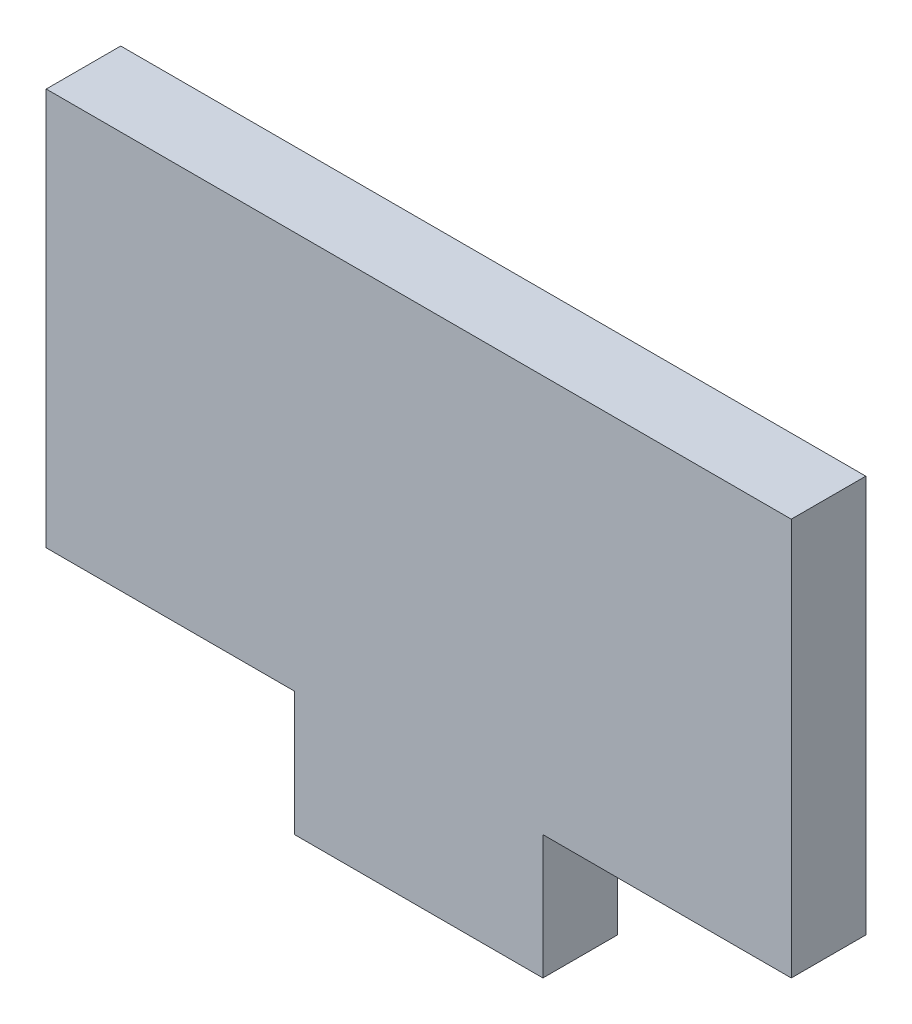
ISO-10303-21;
HEADER;
FILE_DESCRIPTION(('STEP AP214'),'2;1');
FILE_NAME('part.step','',(''),(''),'','','');
FILE_SCHEMA(('AUTOMOTIVE_DESIGN { 1 0 10303 214 1 1 1 1 }'));
ENDSEC;
DATA;
#1=APPLICATION_CONTEXT('core data for automotive mechanical design processes');
#2=APPLICATION_PROTOCOL_DEFINITION('international standard','automotive_design',2000,#1);
#3=PRODUCT_CONTEXT('',#1,'mechanical');
#4=PRODUCT('Part','Part','',(#3));
#5=PRODUCT_RELATED_PRODUCT_CATEGORY('part','',(#4));
#6=PRODUCT_DEFINITION_FORMATION('','',#4);
#7=PRODUCT_DEFINITION_CONTEXT('part definition',#1,'design');
#8=PRODUCT_DEFINITION('design','',#6,#7);
#9=PRODUCT_DEFINITION_SHAPE('','',#8);
#10=(LENGTH_UNIT() NAMED_UNIT(*) SI_UNIT(.MILLI.,.METRE.));
#11=(NAMED_UNIT(*) PLANE_ANGLE_UNIT() SI_UNIT($,.RADIAN.));
#12=(NAMED_UNIT(*) SI_UNIT($,.STERADIAN.) SOLID_ANGLE_UNIT());
#13=UNCERTAINTY_MEASURE_WITH_UNIT(LENGTH_MEASURE(1.E-05),#10,'distance_accuracy_value','');
#14=(GEOMETRIC_REPRESENTATION_CONTEXT(3) GLOBAL_UNCERTAINTY_ASSIGNED_CONTEXT((#13)) GLOBAL_UNIT_ASSIGNED_CONTEXT((#10,
#11,#12)) REPRESENTATION_CONTEXT('',''));
#15=CARTESIAN_POINT('',(0.,0.,0.));
#16=DIRECTION('',(0.,0.,1.));
#17=DIRECTION('',(1.,0.,0.));
#18=AXIS2_PLACEMENT_3D('',#15,#16,#17);
#19=CARTESIAN_POINT('',(15.,10.5,3.));
#20=DIRECTION('',(-1.,0.,0.));
#21=DIRECTION('',(0.,-1.,0.));
#22=AXIS2_PLACEMENT_3D('',#19,#20,#21);
#23=PLANE('',#22);
#24=DIRECTION('',(0.,1.,0.));
#25=VECTOR('',#24,1.);
#26=CARTESIAN_POINT('',(15.,10.5,3.));
#27=LINE('',#26,#25);
#28=CARTESIAN_POINT('',(15.,-5.5,3.));
#29=VERTEX_POINT('',#28);
#30=CARTESIAN_POINT('',(15.,10.5,3.));
#31=VERTEX_POINT('',#30);
#32=EDGE_CURVE('E121',#29,#31,#27,.T.);
#33=ORIENTED_EDGE('',*,*,#32,.F.);
#34=DIRECTION('',(0.,0.,1.));
#35=VECTOR('',#34,1.);
#36=CARTESIAN_POINT('',(15.,-5.5,0.));
#37=LINE('',#36,#35);
#38=CARTESIAN_POINT('',(15.,-5.5,0.));
#39=VERTEX_POINT('',#38);
#40=EDGE_CURVE('E159',#39,#29,#37,.T.);
#41=ORIENTED_EDGE('',*,*,#40,.F.);
#42=DIRECTION('',(0.,1.,0.));
#43=VECTOR('',#42,1.);
#44=CARTESIAN_POINT('',(15.,10.5,0.));
#45=LINE('',#44,#43);
#46=CARTESIAN_POINT('',(15.,10.5,0.));
#47=VERTEX_POINT('',#46);
#48=EDGE_CURVE('E143',#39,#47,#45,.T.);
#49=ORIENTED_EDGE('',*,*,#48,.T.);
#50=DIRECTION('',(0.,0.,-1.));
#51=VECTOR('',#50,1.);
#52=CARTESIAN_POINT('',(15.,10.5,3.));
#53=LINE('',#52,#51);
#54=EDGE_CURVE('E11',#31,#47,#53,.T.);
#55=ORIENTED_EDGE('',*,*,#54,.F.);
#56=EDGE_LOOP('',(#33,#41,#49,#55));
#57=FACE_BOUND('',#56,.T.);
#58=ADVANCED_FACE('F36',(#57),#23,.F.);
#59=CARTESIAN_POINT('',(-15.,10.5,3.));
#60=DIRECTION('',(0.,-1.,0.));
#61=DIRECTION('',(0.,0.,-1.));
#62=AXIS2_PLACEMENT_3D('',#59,#60,#61);
#63=PLANE('',#62);
#64=DIRECTION('',(-1.,0.,0.));
#65=VECTOR('',#64,1.);
#66=CARTESIAN_POINT('',(-15.,10.5,0.));
#67=LINE('',#66,#65);
#68=CARTESIAN_POINT('',(-15.,10.5,0.));
#69=VERTEX_POINT('',#68);
#70=EDGE_CURVE('E127',#47,#69,#67,.T.);
#71=ORIENTED_EDGE('',*,*,#70,.T.);
#72=DIRECTION('',(0.,0.,-1.));
#73=VECTOR('',#72,1.);
#74=CARTESIAN_POINT('',(-15.,10.5,3.));
#75=LINE('',#74,#73);
#76=CARTESIAN_POINT('',(-15.,10.5,3.));
#77=VERTEX_POINT('',#76);
#78=EDGE_CURVE('E43',#77,#69,#75,.T.);
#79=ORIENTED_EDGE('',*,*,#78,.F.);
#80=DIRECTION('',(-1.,0.,0.));
#81=VECTOR('',#80,1.);
#82=CARTESIAN_POINT('',(-15.,10.5,3.));
#83=LINE('',#82,#81);
#84=EDGE_CURVE('E124',#31,#77,#83,.T.);
#85=ORIENTED_EDGE('',*,*,#84,.F.);
#86=ORIENTED_EDGE('',*,*,#54,.T.);
#87=EDGE_LOOP('',(#71,#79,#85,#86));
#88=FACE_BOUND('',#87,.T.);
#89=ADVANCED_FACE('F147',(#88),#63,.F.);
#90=CARTESIAN_POINT('',(-15.,10.5,3.));
#91=DIRECTION('',(1.,0.,0.));
#92=DIRECTION('',(0.,1.,0.));
#93=AXIS2_PLACEMENT_3D('',#90,#91,#92);
#94=PLANE('',#93);
#95=DIRECTION('',(0.,-1.,0.));
#96=VECTOR('',#95,1.);
#97=CARTESIAN_POINT('',(-15.,10.5,0.));
#98=LINE('',#97,#96);
#99=CARTESIAN_POINT('',(-15.,-5.5,0.));
#100=VERTEX_POINT('',#99);
#101=EDGE_CURVE('E122',#69,#100,#98,.T.);
#102=ORIENTED_EDGE('',*,*,#101,.T.);
#103=DIRECTION('',(0.,0.,1.));
#104=VECTOR('',#103,1.);
#105=CARTESIAN_POINT('',(-15.,-5.5,0.));
#106=LINE('',#105,#104);
#107=CARTESIAN_POINT('',(-15.,-5.5,3.));
#108=VERTEX_POINT('',#107);
#109=EDGE_CURVE('E144',#100,#108,#106,.T.);
#110=ORIENTED_EDGE('',*,*,#109,.T.);
#111=DIRECTION('',(0.,-1.,0.));
#112=VECTOR('',#111,1.);
#113=CARTESIAN_POINT('',(-15.,10.5,3.));
#114=LINE('',#113,#112);
#115=EDGE_CURVE('E135',#77,#108,#114,.T.);
#116=ORIENTED_EDGE('',*,*,#115,.F.);
#117=ORIENTED_EDGE('',*,*,#78,.T.);
#118=EDGE_LOOP('',(#102,#110,#116,#117));
#119=FACE_BOUND('',#118,.T.);
#120=ADVANCED_FACE('F152',(#119),#94,.F.);
#121=CARTESIAN_POINT('',(-15.,-10.5,3.));
#122=DIRECTION('',(0.,1.,0.));
#123=DIRECTION('',(0.,0.,1.));
#124=AXIS2_PLACEMENT_3D('',#121,#122,#123);
#125=PLANE('',#124);
#126=DIRECTION('',(1.,0.,0.));
#127=VECTOR('',#126,1.);
#128=CARTESIAN_POINT('',(-15.,-10.5,3.));
#129=LINE('',#128,#127);
#130=CARTESIAN_POINT('',(-5.,-10.5,3.));
#131=VERTEX_POINT('',#130);
#132=CARTESIAN_POINT('',(5.,-10.5,3.));
#133=VERTEX_POINT('',#132);
#134=EDGE_CURVE('E117',#131,#133,#129,.T.);
#135=ORIENTED_EDGE('',*,*,#134,.F.);
#136=DIRECTION('',(0.,0.,1.));
#137=VECTOR('',#136,1.);
#138=CARTESIAN_POINT('',(-5.,-10.5,0.));
#139=LINE('',#138,#137);
#140=CARTESIAN_POINT('',(-5.,-10.5,0.));
#141=VERTEX_POINT('',#140);
#142=EDGE_CURVE('E103',#141,#131,#139,.T.);
#143=ORIENTED_EDGE('',*,*,#142,.F.);
#144=DIRECTION('',(1.,0.,0.));
#145=VECTOR('',#144,1.);
#146=CARTESIAN_POINT('',(-15.,-10.5,0.));
#147=LINE('',#146,#145);
#148=CARTESIAN_POINT('',(5.,-10.5,0.));
#149=VERTEX_POINT('',#148);
#150=EDGE_CURVE('E115',#141,#149,#147,.T.);
#151=ORIENTED_EDGE('',*,*,#150,.T.);
#152=DIRECTION('',(0.,0.,1.));
#153=VECTOR('',#152,1.);
#154=CARTESIAN_POINT('',(5.,-10.5,0.));
#155=LINE('',#154,#153);
#156=EDGE_CURVE('E163',#149,#133,#155,.T.);
#157=ORIENTED_EDGE('',*,*,#156,.T.);
#158=EDGE_LOOP('',(#135,#143,#151,#157));
#159=FACE_BOUND('',#158,.T.);
#160=ADVANCED_FACE('F113',(#159),#125,.F.);
#161=CARTESIAN_POINT('',(0.,0.,3.));
#162=DIRECTION('',(0.,0.,1.));
#163=DIRECTION('',(1.,0.,0.));
#164=AXIS2_PLACEMENT_3D('',#161,#162,#163);
#165=PLANE('',#164);
#166=DIRECTION('',(-1.,0.,0.));
#167=VECTOR('',#166,1.);
#168=CARTESIAN_POINT('',(-15.,-5.5,3.));
#169=LINE('',#168,#167);
#170=CARTESIAN_POINT('',(-5.,-5.5,3.));
#171=VERTEX_POINT('',#170);
#172=EDGE_CURVE('E108',#171,#108,#169,.T.);
#173=ORIENTED_EDGE('',*,*,#172,.F.);
#174=DIRECTION('',(0.,1.,0.));
#175=VECTOR('',#174,1.);
#176=CARTESIAN_POINT('',(-5.,-10.5,3.));
#177=LINE('',#176,#175);
#178=EDGE_CURVE('E165',#131,#171,#177,.T.);
#179=ORIENTED_EDGE('',*,*,#178,.F.);
#180=ORIENTED_EDGE('',*,*,#134,.T.);
#181=DIRECTION('',(0.,-1.,0.));
#182=VECTOR('',#181,1.);
#183=CARTESIAN_POINT('',(5.,-10.5,3.));
#184=LINE('',#183,#182);
#185=CARTESIAN_POINT('',(5.,-5.5,3.));
#186=VERTEX_POINT('',#185);
#187=EDGE_CURVE('E166',#186,#133,#184,.T.);
#188=ORIENTED_EDGE('',*,*,#187,.F.);
#189=DIRECTION('',(-1.,0.,0.));
#190=VECTOR('',#189,1.);
#191=CARTESIAN_POINT('',(15.,-5.5,3.));
#192=LINE('',#191,#190);
#193=EDGE_CURVE('E169',#29,#186,#192,.T.);
#194=ORIENTED_EDGE('',*,*,#193,.F.);
#195=ORIENTED_EDGE('',*,*,#32,.T.);
#196=ORIENTED_EDGE('',*,*,#84,.T.);
#197=ORIENTED_EDGE('',*,*,#115,.T.);
#198=EDGE_LOOP('',(#173,#179,#180,#188,#194,#195,#196,#197));
#199=FACE_BOUND('',#198,.T.);
#200=ADVANCED_FACE('F155',(#199),#165,.T.);
#201=CARTESIAN_POINT('',(0.,0.,0.));
#202=DIRECTION('',(0.,0.,1.));
#203=DIRECTION('',(1.,0.,0.));
#204=AXIS2_PLACEMENT_3D('',#201,#202,#203);
#205=PLANE('',#204);
#206=DIRECTION('',(0.,1.,0.));
#207=VECTOR('',#206,1.);
#208=CARTESIAN_POINT('',(-5.,-10.5,0.));
#209=LINE('',#208,#207);
#210=CARTESIAN_POINT('',(-5.,-5.5,0.));
#211=VERTEX_POINT('',#210);
#212=EDGE_CURVE('E99',#141,#211,#209,.T.);
#213=ORIENTED_EDGE('',*,*,#212,.T.);
#214=DIRECTION('',(-1.,0.,0.));
#215=VECTOR('',#214,1.);
#216=CARTESIAN_POINT('',(-15.,-5.5,0.));
#217=LINE('',#216,#215);
#218=EDGE_CURVE('E50',#211,#100,#217,.T.);
#219=ORIENTED_EDGE('',*,*,#218,.T.);
#220=ORIENTED_EDGE('',*,*,#101,.F.);
#221=ORIENTED_EDGE('',*,*,#70,.F.);
#222=ORIENTED_EDGE('',*,*,#48,.F.);
#223=DIRECTION('',(-1.,0.,0.));
#224=VECTOR('',#223,1.);
#225=CARTESIAN_POINT('',(15.,-5.5,0.));
#226=LINE('',#225,#224);
#227=CARTESIAN_POINT('',(5.,-5.5,0.));
#228=VERTEX_POINT('',#227);
#229=EDGE_CURVE('E168',#39,#228,#226,.T.);
#230=ORIENTED_EDGE('',*,*,#229,.T.);
#231=DIRECTION('',(0.,-1.,0.));
#232=VECTOR('',#231,1.);
#233=CARTESIAN_POINT('',(5.,-10.5,0.));
#234=LINE('',#233,#232);
#235=EDGE_CURVE('E58',#228,#149,#234,.T.);
#236=ORIENTED_EDGE('',*,*,#235,.T.);
#237=ORIENTED_EDGE('',*,*,#150,.F.);
#238=EDGE_LOOP('',(#213,#219,#220,#221,#222,#230,#236,#237));
#239=FACE_BOUND('',#238,.T.);
#240=ADVANCED_FACE('F119',(#239),#205,.F.);
#241=CARTESIAN_POINT('',(5.,-10.5,0.));
#242=DIRECTION('',(-1.,0.,0.));
#243=DIRECTION('',(0.,0.,1.));
#244=AXIS2_PLACEMENT_3D('',#241,#242,#243);
#245=PLANE('',#244);
#246=ORIENTED_EDGE('',*,*,#187,.T.);
#247=ORIENTED_EDGE('',*,*,#156,.F.);
#248=ORIENTED_EDGE('',*,*,#235,.F.);
#249=DIRECTION('',(0.,0.,1.));
#250=VECTOR('',#249,1.);
#251=CARTESIAN_POINT('',(5.,-5.5,0.));
#252=LINE('',#251,#250);
#253=EDGE_CURVE('E161',#228,#186,#252,.T.);
#254=ORIENTED_EDGE('',*,*,#253,.T.);
#255=EDGE_LOOP('',(#246,#247,#248,#254));
#256=FACE_BOUND('',#255,.T.);
#257=ADVANCED_FACE('F186',(#256),#245,.F.);
#258=CARTESIAN_POINT('',(15.,-5.5,0.));
#259=DIRECTION('',(0.,1.,0.));
#260=DIRECTION('',(-1.,0.,0.));
#261=AXIS2_PLACEMENT_3D('',#258,#259,#260);
#262=PLANE('',#261);
#263=ORIENTED_EDGE('',*,*,#193,.T.);
#264=ORIENTED_EDGE('',*,*,#253,.F.);
#265=ORIENTED_EDGE('',*,*,#229,.F.);
#266=ORIENTED_EDGE('',*,*,#40,.T.);
#267=EDGE_LOOP('',(#263,#264,#265,#266));
#268=FACE_BOUND('',#267,.T.);
#269=ADVANCED_FACE('F179',(#268),#262,.F.);
#270=CARTESIAN_POINT('',(-15.,-5.5,0.));
#271=DIRECTION('',(0.,1.,0.));
#272=DIRECTION('',(0.,0.,1.));
#273=AXIS2_PLACEMENT_3D('',#270,#271,#272);
#274=PLANE('',#273);
#275=ORIENTED_EDGE('',*,*,#172,.T.);
#276=ORIENTED_EDGE('',*,*,#109,.F.);
#277=ORIENTED_EDGE('',*,*,#218,.F.);
#278=DIRECTION('',(0.,0.,1.));
#279=VECTOR('',#278,1.);
#280=CARTESIAN_POINT('',(-5.,-5.5,0.));
#281=LINE('',#280,#279);
#282=EDGE_CURVE('E105',#211,#171,#281,.T.);
#283=ORIENTED_EDGE('',*,*,#282,.T.);
#284=EDGE_LOOP('',(#275,#276,#277,#283));
#285=FACE_BOUND('',#284,.T.);
#286=ADVANCED_FACE('F177',(#285),#274,.F.);
#287=CARTESIAN_POINT('',(-5.,-10.5,0.));
#288=DIRECTION('',(1.,0.,0.));
#289=DIRECTION('',(0.,0.,-1.));
#290=AXIS2_PLACEMENT_3D('',#287,#288,#289);
#291=PLANE('',#290);
#292=ORIENTED_EDGE('',*,*,#178,.T.);
#293=ORIENTED_EDGE('',*,*,#282,.F.);
#294=ORIENTED_EDGE('',*,*,#212,.F.);
#295=ORIENTED_EDGE('',*,*,#142,.T.);
#296=EDGE_LOOP('',(#292,#293,#294,#295));
#297=FACE_BOUND('',#296,.T.);
#298=ADVANCED_FACE('F102',(#297),#291,.F.);
#299=CLOSED_SHELL('',(#58,#89,#120,#160,#200,#240,#257,#269,#286,#298));
#300=MANIFOLD_SOLID_BREP('B2',#299);
#301=ADVANCED_BREP_SHAPE_REPRESENTATION('',(#18,#300),#14);
#302=SHAPE_DEFINITION_REPRESENTATION(#9,#301);
ENDSEC;
END-ISO-10303-21;
